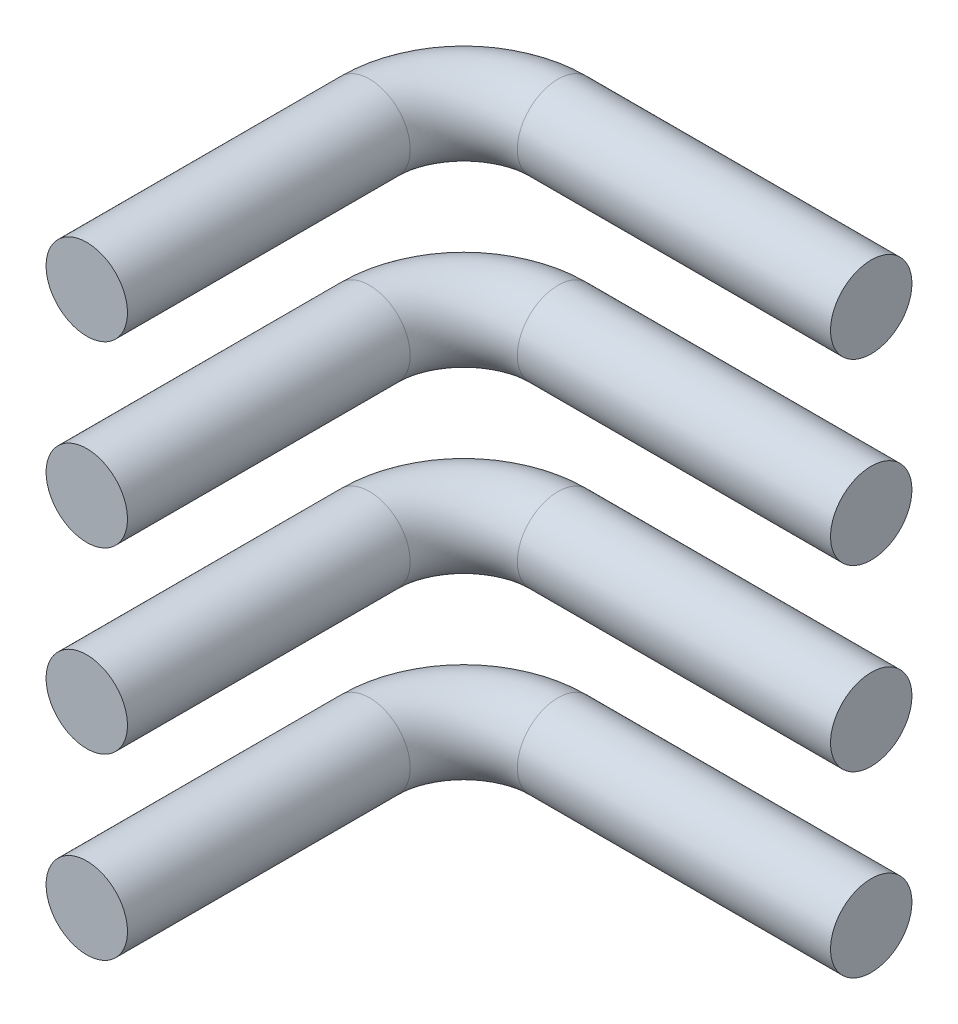
ISO-10303-21;
HEADER;
FILE_DESCRIPTION(('STEP AP214'),'2;1');
FILE_NAME('part.step','',(''),(''),'','','');
FILE_SCHEMA(('AUTOMOTIVE_DESIGN { 1 0 10303 214 1 1 1 1 }'));
ENDSEC;
DATA;
#1=APPLICATION_CONTEXT('core data for automotive mechanical design processes');
#2=APPLICATION_PROTOCOL_DEFINITION('international standard','automotive_design',2000,#1);
#3=PRODUCT_CONTEXT('',#1,'mechanical');
#4=PRODUCT('Part','Part','',(#3));
#5=PRODUCT_RELATED_PRODUCT_CATEGORY('part','',(#4));
#6=PRODUCT_DEFINITION_FORMATION('','',#4);
#7=PRODUCT_DEFINITION_CONTEXT('part definition',#1,'design');
#8=PRODUCT_DEFINITION('design','',#6,#7);
#9=PRODUCT_DEFINITION_SHAPE('','',#8);
#10=(LENGTH_UNIT() NAMED_UNIT(*) SI_UNIT(.MILLI.,.METRE.));
#11=(NAMED_UNIT(*) PLANE_ANGLE_UNIT() SI_UNIT($,.RADIAN.));
#12=(NAMED_UNIT(*) SI_UNIT($,.STERADIAN.) SOLID_ANGLE_UNIT());
#13=UNCERTAINTY_MEASURE_WITH_UNIT(LENGTH_MEASURE(1.E-05),#10,'distance_accuracy_value','');
#14=(GEOMETRIC_REPRESENTATION_CONTEXT(3) GLOBAL_UNCERTAINTY_ASSIGNED_CONTEXT((#13)) GLOBAL_UNIT_ASSIGNED_CONTEXT((#10,
#11,#12)) REPRESENTATION_CONTEXT('',''));
#15=CARTESIAN_POINT('',(0.,0.,0.));
#16=DIRECTION('',(0.,0.,1.));
#17=DIRECTION('',(1.,0.,0.));
#18=AXIS2_PLACEMENT_3D('',#15,#16,#17);
#19=CARTESIAN_POINT('',(0.,4.29855600558658,5.));
#20=DIRECTION('',(0.,0.,1.));
#21=DIRECTION('',(1.,0.,0.));
#22=AXIS2_PLACEMENT_3D('',#19,#20,#21);
#23=CYLINDRICAL_SURFACE('',#22,2.159);
#24=CARTESIAN_POINT('',(0.,4.29855600558658,5.));
#25=DIRECTION('',(0.,0.,-1.));
#26=DIRECTION('',(-1.,0.,0.));
#27=AXIS2_PLACEMENT_3D('',#24,#25,#26);
#28=CIRCLE('',#27,2.159);
#29=CARTESIAN_POINT('',(-2.159,4.29855600558658,5.));
#30=VERTEX_POINT('',#29);
#31=EDGE_CURVE('E43',#30,#30,#28,.T.);
#32=ORIENTED_EDGE('',*,*,#31,.F.);
#33=EDGE_LOOP('',(#32));
#34=FACE_BOUND('',#33,.T.);
#35=CARTESIAN_POINT('',(0.,4.29855600558658,20.));
#36=DIRECTION('',(0.,0.,-1.));
#37=DIRECTION('',(-1.,0.,0.));
#38=AXIS2_PLACEMENT_3D('',#35,#36,#37);
#39=CIRCLE('',#38,2.159);
#40=CARTESIAN_POINT('',(-2.159,4.29855600558658,20.));
#41=VERTEX_POINT('',#40);
#42=EDGE_CURVE('E11',#41,#41,#39,.T.);
#43=ORIENTED_EDGE('',*,*,#42,.T.);
#44=EDGE_LOOP('',(#43));
#45=FACE_BOUND('',#44,.T.);
#46=ADVANCED_FACE('F37',(#34,#45),#23,.T.);
#47=CARTESIAN_POINT('',(5.,4.29855600558658,5.));
#48=DIRECTION('',(0.,1.,0.));
#49=DIRECTION('',(0.,0.,1.));
#50=AXIS2_PLACEMENT_3D('',#47,#48,#49);
#51=TOROIDAL_SURFACE('',#50,5.,2.159);
#52=CARTESIAN_POINT('',(5.00000000000004,4.29855600558658,0.));
#53=DIRECTION('',(1.,0.,0.));
#54=DIRECTION('',(0.,0.,-1.));
#55=AXIS2_PLACEMENT_3D('',#52,#53,#54);
#56=CIRCLE('',#55,2.159);
#57=CARTESIAN_POINT('',(5.00000000000006,4.29855600558658,-2.159));
#58=VERTEX_POINT('',#57);
#59=EDGE_CURVE('E47',#58,#58,#56,.T.);
#60=CARTESIAN_POINT('',(5.,4.29855600558658,5.));
#61=DIRECTION('',(0.,1.,0.));
#62=DIRECTION('',(0.,0.,1.));
#63=AXIS2_PLACEMENT_3D('',#60,#61,#62);
#64=CIRCLE('',#63,7.159);
#65=EDGE_CURVE('',#58,#30,#64,.T.);
#66=ORIENTED_EDGE('',*,*,#59,.F.);
#67=ORIENTED_EDGE('',*,*,#31,.T.);
#68=ORIENTED_EDGE('',*,*,#65,.T.);
#69=ORIENTED_EDGE('',*,*,#65,.F.);
#70=EDGE_LOOP('',(#66,#68,#67,#69));
#71=FACE_BOUND('',#70,.T.);
#72=ADVANCED_FACE('F63',(#71),#51,.T.);
#73=CARTESIAN_POINT('',(18.3666500000001,4.29855600558658,0.));
#74=DIRECTION('',(1.,0.,0.));
#75=DIRECTION('',(0.,0.,-1.));
#76=AXIS2_PLACEMENT_3D('',#73,#74,#75);
#77=CYLINDRICAL_SURFACE('',#76,2.159);
#78=CARTESIAN_POINT('',(21.61665,4.29855600558658,0.));
#79=DIRECTION('',(1.,0.,0.));
#80=DIRECTION('',(0.,0.,-1.));
#81=AXIS2_PLACEMENT_3D('',#78,#79,#80);
#82=CIRCLE('',#81,2.159);
#83=CARTESIAN_POINT('',(21.61665,4.29855600558658,-2.159));
#84=VERTEX_POINT('',#83);
#85=EDGE_CURVE('E51',#84,#84,#82,.T.);
#86=CARTESIAN_POINT('',(21.61665,4.29855600558658,-2.159));
#87=CARTESIAN_POINT('',(21.4435598958334,4.29855600558658,-2.159));
#88=CARTESIAN_POINT('',(21.2704697916667,4.29855600558658,-2.159));
#89=CARTESIAN_POINT('',(20.9242895833334,4.29855600558658,-2.159));
#90=CARTESIAN_POINT('',(20.7511994791667,4.29855600558658,-2.159));
#91=CARTESIAN_POINT('',(20.4050192708334,4.29855600558658,-2.159));
#92=CARTESIAN_POINT('',(20.2319291666667,4.29855600558658,-2.159));
#93=CARTESIAN_POINT('',(19.8857489583334,4.29855600558658,-2.159));
#94=CARTESIAN_POINT('',(19.7126588541667,4.29855600558658,-2.159));
#95=CARTESIAN_POINT('',(19.3664786458334,4.29855600558658,-2.159));
#96=CARTESIAN_POINT('',(19.1933885416667,4.29855600558658,-2.159));
#97=CARTESIAN_POINT('',(18.8472083333334,4.29855600558658,-2.159));
#98=CARTESIAN_POINT('',(18.6741182291667,4.29855600558658,-2.159));
#99=CARTESIAN_POINT('',(18.3279380208334,4.29855600558658,-2.159));
#100=CARTESIAN_POINT('',(18.1548479166667,4.29855600558658,-2.159));
#101=CARTESIAN_POINT('',(17.8086677083334,4.29855600558658,-2.159));
#102=CARTESIAN_POINT('',(17.6355776041667,4.29855600558658,-2.159));
#103=CARTESIAN_POINT('',(17.2893973958334,4.29855600558658,-2.159));
#104=CARTESIAN_POINT('',(17.1163072916667,4.29855600558658,-2.159));
#105=CARTESIAN_POINT('',(16.7701270833334,4.29855600558658,-2.159));
#106=CARTESIAN_POINT('',(16.5970369791667,4.29855600558658,-2.159));
#107=CARTESIAN_POINT('',(16.2508567708334,4.29855600558658,-2.159));
#108=CARTESIAN_POINT('',(16.0777666666667,4.29855600558658,-2.159));
#109=CARTESIAN_POINT('',(15.7315864583334,4.29855600558658,-2.159));
#110=CARTESIAN_POINT('',(15.5584963541667,4.29855600558658,-2.159));
#111=CARTESIAN_POINT('',(15.2123161458334,4.29855600558658,-2.159));
#112=CARTESIAN_POINT('',(15.0392260416667,4.29855600558658,-2.159));
#113=CARTESIAN_POINT('',(14.6930458333334,4.29855600558658,-2.159));
#114=CARTESIAN_POINT('',(14.5199557291667,4.29855600558658,-2.159));
#115=CARTESIAN_POINT('',(14.1737755208334,4.29855600558658,-2.159));
#116=CARTESIAN_POINT('',(14.0006854166667,4.29855600558658,-2.159));
#117=CARTESIAN_POINT('',(13.6545052083334,4.29855600558658,-2.159));
#118=CARTESIAN_POINT('',(13.4814151041667,4.29855600558658,-2.159));
#119=CARTESIAN_POINT('',(13.1352348958334,4.29855600558658,-2.159));
#120=CARTESIAN_POINT('',(12.9621447916667,4.29855600558658,-2.159));
#121=CARTESIAN_POINT('',(12.6159645833334,4.29855600558658,-2.159));
#122=CARTESIAN_POINT('',(12.4428744791667,4.29855600558658,-2.159));
#123=CARTESIAN_POINT('',(12.0966942708334,4.29855600558658,-2.159));
#124=CARTESIAN_POINT('',(11.9236041666667,4.29855600558658,-2.159));
#125=CARTESIAN_POINT('',(11.5774239583334,4.29855600558658,-2.159));
#126=CARTESIAN_POINT('',(11.4043338541667,4.29855600558658,-2.159));
#127=CARTESIAN_POINT('',(11.0581536458334,4.29855600558658,-2.159));
#128=CARTESIAN_POINT('',(10.8850635416667,4.29855600558658,-2.159));
#129=CARTESIAN_POINT('',(10.5388833333334,4.29855600558658,-2.159));
#130=CARTESIAN_POINT('',(10.3657932291667,4.29855600558658,-2.159));
#131=CARTESIAN_POINT('',(10.0196130208334,4.29855600558658,-2.159));
#132=CARTESIAN_POINT('',(9.84652291666671,4.29855600558658,-2.159));
#133=CARTESIAN_POINT('',(9.50034270833338,4.29855600558658,-2.159));
#134=CARTESIAN_POINT('',(9.32725260416671,4.29855600558658,-2.159));
#135=CARTESIAN_POINT('',(8.98107239583338,4.29855600558658,-2.159));
#136=CARTESIAN_POINT('',(8.80798229166671,4.29855600558658,-2.159));
#137=CARTESIAN_POINT('',(8.46180208333338,4.29855600558658,-2.159));
#138=CARTESIAN_POINT('',(8.28871197916671,4.29855600558658,-2.159));
#139=CARTESIAN_POINT('',(7.94253177083338,4.29855600558658,-2.159));
#140=CARTESIAN_POINT('',(7.76944166666672,4.29855600558658,-2.159));
#141=CARTESIAN_POINT('',(7.42326145833338,4.29855600558658,-2.159));
#142=CARTESIAN_POINT('',(7.25017135416672,4.29855600558658,-2.159));
#143=CARTESIAN_POINT('',(6.90399114583338,4.29855600558658,-2.159));
#144=CARTESIAN_POINT('',(6.73090104166672,4.29855600558658,-2.159));
#145=CARTESIAN_POINT('',(6.38472083333339,4.29855600558658,-2.159));
#146=CARTESIAN_POINT('',(6.21163072916672,4.29855600558658,-2.159));
#147=CARTESIAN_POINT('',(5.86545052083339,4.29855600558658,-2.159));
#148=CARTESIAN_POINT('',(5.69236041666672,4.29855600558658,-2.159));
#149=CARTESIAN_POINT('',(5.34618020833339,4.29855600558658,-2.159));
#150=CARTESIAN_POINT('',(5.17309010416672,4.29855600558658,-2.159));
#151=CARTESIAN_POINT('',(5.00000000000006,4.29855600558658,-2.159));
#152=B_SPLINE_CURVE_WITH_KNOTS('',3,(#86,#87,#88,#89,#90,#91,#92,#93,#94,#95,#96,#97,#98,#99,
#100,#101,#102,#103,#104,#105,#106,#107,#108,#109,#110,#111,#112,#113,#114,#115,#116,#117,#118,
#119,#120,#121,#122,#123,#124,#125,#126,#127,#128,#129,#130,#131,#132,#133,#134,#135,#136,#137,
#138,#139,#140,#141,#142,#143,#144,#145,#146,#147,#148,#149,#150,#151),.UNSPECIFIED.,.F.,.F.,(4,
2,2,2,2,2,2,2,2,2,2,2,2,2,2,2,2,2,2,2,2,2,2,2,2,2,2,2,2,2,2,2,4),(0.,0.5192703125,1.038540625,
1.5578109375,2.07708125,2.59635156249999,3.115621875,3.63489218749999,4.15416249999999,
4.67343281249999,5.19270312499999,5.71197343749999,6.23124374999999,6.75051406249999,
7.26978437499998,7.78905468749998,8.30832499999998,8.82759531249998,9.34686562499998,
9.86613593749998,10.38540625,10.9046765625,11.423946875,11.9432171875,12.4624875,12.9817578125,
13.501028125,14.0202984375,14.53956875,15.0588390625,15.578109375,16.0973796875,16.61665),.UNSPECIFIED.);
#153=EDGE_CURVE('BSEAM59',#84,#58,#152,.T.);
#154=ORIENTED_EDGE('',*,*,#85,.F.);
#155=ORIENTED_EDGE('',*,*,#59,.T.);
#156=ORIENTED_EDGE('',*,*,#153,.T.);
#157=ORIENTED_EDGE('',*,*,#153,.F.);
#158=EDGE_LOOP('',(#154,#156,#155,#157));
#159=FACE_BOUND('',#158,.T.);
#160=ADVANCED_FACE('F59',(#159),#77,.T.);
#161=CARTESIAN_POINT('',(0.,4.29855600558658,20.));
#162=DIRECTION('',(0.,0.,-1.));
#163=DIRECTION('',(-1.,0.,0.));
#164=AXIS2_PLACEMENT_3D('',#161,#162,#163);
#165=PLANE('',#164);
#166=ORIENTED_EDGE('',*,*,#42,.F.);
#167=EDGE_LOOP('',(#166));
#168=FACE_BOUND('',#167,.T.);
#169=ADVANCED_FACE('F62',(#168),#165,.F.);
#170=CARTESIAN_POINT('',(21.61665,4.29855600558658,0.));
#171=DIRECTION('',(1.,0.,0.));
#172=DIRECTION('',(0.,0.,-1.));
#173=AXIS2_PLACEMENT_3D('',#170,#171,#172);
#174=PLANE('',#173);
#175=ORIENTED_EDGE('',*,*,#85,.T.);
#176=EDGE_LOOP('',(#175));
#177=FACE_BOUND('',#176,.T.);
#178=ADVANCED_FACE('F57',(#177),#174,.T.);
#179=CLOSED_SHELL('',(#46,#72,#160,#169,#178));
#180=MANIFOLD_SOLID_BREP('B2',#179);
#181=CARTESIAN_POINT('',(0.,-5.17564399441342,5.));
#182=DIRECTION('',(0.,0.,1.));
#183=DIRECTION('',(1.,0.,0.));
#184=AXIS2_PLACEMENT_3D('',#181,#182,#183);
#185=CYLINDRICAL_SURFACE('',#184,2.159);
#186=CARTESIAN_POINT('',(0.,-5.17564399441342,5.));
#187=DIRECTION('',(0.,0.,-1.));
#188=DIRECTION('',(-1.,0.,0.));
#189=AXIS2_PLACEMENT_3D('',#186,#187,#188);
#190=CIRCLE('',#189,2.159);
#191=CARTESIAN_POINT('',(-2.159,-5.17564399441342,5.));
#192=VERTEX_POINT('',#191);
#193=EDGE_CURVE('E124',#192,#192,#190,.T.);
#194=ORIENTED_EDGE('',*,*,#193,.F.);
#195=EDGE_LOOP('',(#194));
#196=FACE_BOUND('',#195,.T.);
#197=CARTESIAN_POINT('',(0.,-5.17564399441342,20.));
#198=DIRECTION('',(0.,0.,-1.));
#199=DIRECTION('',(-1.,0.,0.));
#200=AXIS2_PLACEMENT_3D('',#197,#198,#199);
#201=CIRCLE('',#200,2.159);
#202=CARTESIAN_POINT('',(-2.159,-5.17564399441342,20.));
#203=VERTEX_POINT('',#202);
#204=EDGE_CURVE('E36',#203,#203,#201,.T.);
#205=ORIENTED_EDGE('',*,*,#204,.T.);
#206=EDGE_LOOP('',(#205));
#207=FACE_BOUND('',#206,.T.);
#208=ADVANCED_FACE('F118',(#196,#207),#185,.T.);
#209=CARTESIAN_POINT('',(5.,-5.17564399441342,5.));
#210=DIRECTION('',(0.,1.,0.));
#211=DIRECTION('',(0.,0.,1.));
#212=AXIS2_PLACEMENT_3D('',#209,#210,#211);
#213=TOROIDAL_SURFACE('',#212,5.,2.159);
#214=CARTESIAN_POINT('',(5.00000000000004,-5.17564399441342,0.));
#215=DIRECTION('',(1.,0.,0.));
#216=DIRECTION('',(0.,0.,-1.));
#217=AXIS2_PLACEMENT_3D('',#214,#215,#216);
#218=CIRCLE('',#217,2.159);
#219=CARTESIAN_POINT('',(5.00000000000006,-5.17564399441342,-2.159));
#220=VERTEX_POINT('',#219);
#221=EDGE_CURVE('E128',#220,#220,#218,.T.);
#222=CARTESIAN_POINT('',(5.,-5.17564399441342,5.));
#223=DIRECTION('',(0.,1.,0.));
#224=DIRECTION('',(0.,0.,1.));
#225=AXIS2_PLACEMENT_3D('',#222,#223,#224);
#226=CIRCLE('',#225,7.159);
#227=EDGE_CURVE('',#220,#192,#226,.T.);
#228=ORIENTED_EDGE('',*,*,#221,.F.);
#229=ORIENTED_EDGE('',*,*,#193,.T.);
#230=ORIENTED_EDGE('',*,*,#227,.T.);
#231=ORIENTED_EDGE('',*,*,#227,.F.);
#232=EDGE_LOOP('',(#228,#230,#229,#231));
#233=FACE_BOUND('',#232,.T.);
#234=ADVANCED_FACE('F144',(#233),#213,.T.);
#235=CARTESIAN_POINT('',(18.3666500000001,-5.17564399441342,0.));
#236=DIRECTION('',(1.,0.,0.));
#237=DIRECTION('',(0.,0.,-1.));
#238=AXIS2_PLACEMENT_3D('',#235,#236,#237);
#239=CYLINDRICAL_SURFACE('',#238,2.159);
#240=CARTESIAN_POINT('',(21.61665,-5.17564399441342,0.));
#241=DIRECTION('',(1.,0.,0.));
#242=DIRECTION('',(0.,0.,-1.));
#243=AXIS2_PLACEMENT_3D('',#240,#241,#242);
#244=CIRCLE('',#243,2.159);
#245=CARTESIAN_POINT('',(21.61665,-5.17564399441342,-2.159));
#246=VERTEX_POINT('',#245);
#247=EDGE_CURVE('E132',#246,#246,#244,.T.);
#248=CARTESIAN_POINT('',(21.61665,-5.17564399441342,-2.159));
#249=CARTESIAN_POINT('',(21.4435598958334,-5.17564399441342,-2.159));
#250=CARTESIAN_POINT('',(21.2704697916667,-5.17564399441342,-2.159));
#251=CARTESIAN_POINT('',(20.9242895833334,-5.17564399441342,-2.159));
#252=CARTESIAN_POINT('',(20.7511994791667,-5.17564399441342,-2.159));
#253=CARTESIAN_POINT('',(20.4050192708334,-5.17564399441342,-2.159));
#254=CARTESIAN_POINT('',(20.2319291666667,-5.17564399441342,-2.159));
#255=CARTESIAN_POINT('',(19.8857489583334,-5.17564399441342,-2.159));
#256=CARTESIAN_POINT('',(19.7126588541667,-5.17564399441342,-2.159));
#257=CARTESIAN_POINT('',(19.3664786458334,-5.17564399441342,-2.159));
#258=CARTESIAN_POINT('',(19.1933885416667,-5.17564399441342,-2.159));
#259=CARTESIAN_POINT('',(18.8472083333334,-5.17564399441342,-2.159));
#260=CARTESIAN_POINT('',(18.6741182291667,-5.17564399441342,-2.159));
#261=CARTESIAN_POINT('',(18.3279380208334,-5.17564399441342,-2.159));
#262=CARTESIAN_POINT('',(18.1548479166667,-5.17564399441342,-2.159));
#263=CARTESIAN_POINT('',(17.8086677083334,-5.17564399441342,-2.159));
#264=CARTESIAN_POINT('',(17.6355776041667,-5.17564399441342,-2.159));
#265=CARTESIAN_POINT('',(17.2893973958334,-5.17564399441342,-2.159));
#266=CARTESIAN_POINT('',(17.1163072916667,-5.17564399441342,-2.159));
#267=CARTESIAN_POINT('',(16.7701270833334,-5.17564399441342,-2.159));
#268=CARTESIAN_POINT('',(16.5970369791667,-5.17564399441342,-2.159));
#269=CARTESIAN_POINT('',(16.2508567708334,-5.17564399441342,-2.159));
#270=CARTESIAN_POINT('',(16.0777666666667,-5.17564399441342,-2.159));
#271=CARTESIAN_POINT('',(15.7315864583334,-5.17564399441342,-2.159));
#272=CARTESIAN_POINT('',(15.5584963541667,-5.17564399441342,-2.159));
#273=CARTESIAN_POINT('',(15.2123161458334,-5.17564399441342,-2.159));
#274=CARTESIAN_POINT('',(15.0392260416667,-5.17564399441342,-2.159));
#275=CARTESIAN_POINT('',(14.6930458333334,-5.17564399441342,-2.159));
#276=CARTESIAN_POINT('',(14.5199557291667,-5.17564399441342,-2.159));
#277=CARTESIAN_POINT('',(14.1737755208334,-5.17564399441342,-2.159));
#278=CARTESIAN_POINT('',(14.0006854166667,-5.17564399441342,-2.159));
#279=CARTESIAN_POINT('',(13.6545052083334,-5.17564399441342,-2.159));
#280=CARTESIAN_POINT('',(13.4814151041667,-5.17564399441342,-2.159));
#281=CARTESIAN_POINT('',(13.1352348958334,-5.17564399441342,-2.159));
#282=CARTESIAN_POINT('',(12.9621447916667,-5.17564399441342,-2.159));
#283=CARTESIAN_POINT('',(12.6159645833334,-5.17564399441342,-2.159));
#284=CARTESIAN_POINT('',(12.4428744791667,-5.17564399441342,-2.159));
#285=CARTESIAN_POINT('',(12.0966942708334,-5.17564399441342,-2.159));
#286=CARTESIAN_POINT('',(11.9236041666667,-5.17564399441342,-2.159));
#287=CARTESIAN_POINT('',(11.5774239583334,-5.17564399441342,-2.159));
#288=CARTESIAN_POINT('',(11.4043338541667,-5.17564399441342,-2.159));
#289=CARTESIAN_POINT('',(11.0581536458334,-5.17564399441342,-2.159));
#290=CARTESIAN_POINT('',(10.8850635416667,-5.17564399441342,-2.159));
#291=CARTESIAN_POINT('',(10.5388833333334,-5.17564399441342,-2.159));
#292=CARTESIAN_POINT('',(10.3657932291667,-5.17564399441342,-2.159));
#293=CARTESIAN_POINT('',(10.0196130208334,-5.17564399441342,-2.159));
#294=CARTESIAN_POINT('',(9.84652291666671,-5.17564399441342,-2.159));
#295=CARTESIAN_POINT('',(9.50034270833338,-5.17564399441342,-2.159));
#296=CARTESIAN_POINT('',(9.32725260416671,-5.17564399441342,-2.159));
#297=CARTESIAN_POINT('',(8.98107239583338,-5.17564399441342,-2.159));
#298=CARTESIAN_POINT('',(8.80798229166671,-5.17564399441342,-2.159));
#299=CARTESIAN_POINT('',(8.46180208333338,-5.17564399441342,-2.159));
#300=CARTESIAN_POINT('',(8.28871197916671,-5.17564399441342,-2.159));
#301=CARTESIAN_POINT('',(7.94253177083338,-5.17564399441342,-2.159));
#302=CARTESIAN_POINT('',(7.76944166666672,-5.17564399441342,-2.159));
#303=CARTESIAN_POINT('',(7.42326145833338,-5.17564399441342,-2.159));
#304=CARTESIAN_POINT('',(7.25017135416672,-5.17564399441342,-2.159));
#305=CARTESIAN_POINT('',(6.90399114583338,-5.17564399441342,-2.159));
#306=CARTESIAN_POINT('',(6.73090104166672,-5.17564399441342,-2.159));
#307=CARTESIAN_POINT('',(6.38472083333339,-5.17564399441342,-2.159));
#308=CARTESIAN_POINT('',(6.21163072916672,-5.17564399441342,-2.159));
#309=CARTESIAN_POINT('',(5.86545052083339,-5.17564399441342,-2.159));
#310=CARTESIAN_POINT('',(5.69236041666672,-5.17564399441342,-2.159));
#311=CARTESIAN_POINT('',(5.34618020833339,-5.17564399441342,-2.159));
#312=CARTESIAN_POINT('',(5.17309010416672,-5.17564399441342,-2.159));
#313=CARTESIAN_POINT('',(5.00000000000006,-5.17564399441342,-2.159));
#314=B_SPLINE_CURVE_WITH_KNOTS('',3,(#248,#249,#250,#251,#252,#253,#254,#255,#256,#257,#258,
#259,#260,#261,#262,#263,#264,#265,#266,#267,#268,#269,#270,#271,#272,#273,#274,#275,#276,#277,
#278,#279,#280,#281,#282,#283,#284,#285,#286,#287,#288,#289,#290,#291,#292,#293,#294,#295,#296,
#297,#298,#299,#300,#301,#302,#303,#304,#305,#306,#307,#308,#309,#310,#311,#312,#313),
.UNSPECIFIED.,.F.,.F.,(4,2,2,2,2,2,2,2,2,2,2,2,2,2,2,2,2,2,2,2,2,2,2,2,2,2,2,2,2,2,2,2,4),(0.,
0.5192703125,1.038540625,1.5578109375,2.07708125,2.59635156249999,3.115621875,3.63489218749999,
4.15416249999999,4.67343281249999,5.19270312499999,5.71197343749999,6.23124374999999,
6.75051406249999,7.26978437499998,7.78905468749998,8.30832499999998,8.82759531249998,
9.34686562499998,9.86613593749998,10.38540625,10.9046765625,11.423946875,11.9432171875,
12.4624875,12.9817578125,13.501028125,14.0202984375,14.53956875,15.0588390625,15.578109375,
16.0973796875,16.61665),.UNSPECIFIED.);
#315=EDGE_CURVE('BSEAM140',#246,#220,#314,.T.);
#316=ORIENTED_EDGE('',*,*,#247,.F.);
#317=ORIENTED_EDGE('',*,*,#221,.T.);
#318=ORIENTED_EDGE('',*,*,#315,.T.);
#319=ORIENTED_EDGE('',*,*,#315,.F.);
#320=EDGE_LOOP('',(#316,#318,#317,#319));
#321=FACE_BOUND('',#320,.T.);
#322=ADVANCED_FACE('F140',(#321),#239,.T.);
#323=CARTESIAN_POINT('',(0.,-5.17564399441342,20.));
#324=DIRECTION('',(0.,0.,-1.));
#325=DIRECTION('',(-1.,0.,0.));
#326=AXIS2_PLACEMENT_3D('',#323,#324,#325);
#327=PLANE('',#326);
#328=ORIENTED_EDGE('',*,*,#204,.F.);
#329=EDGE_LOOP('',(#328));
#330=FACE_BOUND('',#329,.T.);
#331=ADVANCED_FACE('F143',(#330),#327,.F.);
#332=CARTESIAN_POINT('',(21.61665,-5.17564399441342,0.));
#333=DIRECTION('',(1.,0.,0.));
#334=DIRECTION('',(0.,0.,-1.));
#335=AXIS2_PLACEMENT_3D('',#332,#333,#334);
#336=PLANE('',#335);
#337=ORIENTED_EDGE('',*,*,#247,.T.);
#338=EDGE_LOOP('',(#337));
#339=FACE_BOUND('',#338,.T.);
#340=ADVANCED_FACE('F138',(#339),#336,.T.);
#341=CLOSED_SHELL('',(#208,#234,#322,#331,#340));
#342=MANIFOLD_SOLID_BREP('B6',#341);
#343=CARTESIAN_POINT('',(0.,13.7727560055866,5.));
#344=DIRECTION('',(0.,0.,1.));
#345=DIRECTION('',(1.,0.,0.));
#346=AXIS2_PLACEMENT_3D('',#343,#344,#345);
#347=CYLINDRICAL_SURFACE('',#346,2.159);
#348=CARTESIAN_POINT('',(0.,13.7727560055866,5.));
#349=DIRECTION('',(0.,0.,-1.));
#350=DIRECTION('',(-1.,0.,0.));
#351=AXIS2_PLACEMENT_3D('',#348,#349,#350);
#352=CIRCLE('',#351,2.159);
#353=CARTESIAN_POINT('',(-2.159,13.7727560055866,5.));
#354=VERTEX_POINT('',#353);
#355=EDGE_CURVE('E204',#354,#354,#352,.T.);
#356=ORIENTED_EDGE('',*,*,#355,.F.);
#357=EDGE_LOOP('',(#356));
#358=FACE_BOUND('',#357,.T.);
#359=CARTESIAN_POINT('',(0.,13.7727560055866,20.));
#360=DIRECTION('',(0.,0.,-1.));
#361=DIRECTION('',(-1.,0.,0.));
#362=AXIS2_PLACEMENT_3D('',#359,#360,#361);
#363=CIRCLE('',#362,2.159);
#364=CARTESIAN_POINT('',(-2.159,13.7727560055866,20.));
#365=VERTEX_POINT('',#364);
#366=EDGE_CURVE('E117',#365,#365,#363,.T.);
#367=ORIENTED_EDGE('',*,*,#366,.T.);
#368=EDGE_LOOP('',(#367));
#369=FACE_BOUND('',#368,.T.);
#370=ADVANCED_FACE('F198',(#358,#369),#347,.T.);
#371=CARTESIAN_POINT('',(5.,13.7727560055866,5.));
#372=DIRECTION('',(0.,1.,0.));
#373=DIRECTION('',(0.,0.,1.));
#374=AXIS2_PLACEMENT_3D('',#371,#372,#373);
#375=TOROIDAL_SURFACE('',#374,5.,2.159);
#376=CARTESIAN_POINT('',(5.00000000000004,13.7727560055866,0.));
#377=DIRECTION('',(1.,0.,0.));
#378=DIRECTION('',(0.,0.,-1.));
#379=AXIS2_PLACEMENT_3D('',#376,#377,#378);
#380=CIRCLE('',#379,2.159);
#381=CARTESIAN_POINT('',(5.00000000000006,13.7727560055866,-2.159));
#382=VERTEX_POINT('',#381);
#383=EDGE_CURVE('E208',#382,#382,#380,.T.);
#384=CARTESIAN_POINT('',(5.,13.7727560055866,5.));
#385=DIRECTION('',(0.,1.,0.));
#386=DIRECTION('',(0.,0.,1.));
#387=AXIS2_PLACEMENT_3D('',#384,#385,#386);
#388=CIRCLE('',#387,7.159);
#389=EDGE_CURVE('',#382,#354,#388,.T.);
#390=ORIENTED_EDGE('',*,*,#383,.F.);
#391=ORIENTED_EDGE('',*,*,#355,.T.);
#392=ORIENTED_EDGE('',*,*,#389,.T.);
#393=ORIENTED_EDGE('',*,*,#389,.F.);
#394=EDGE_LOOP('',(#390,#392,#391,#393));
#395=FACE_BOUND('',#394,.T.);
#396=ADVANCED_FACE('F224',(#395),#375,.T.);
#397=CARTESIAN_POINT('',(18.3666500000001,13.7727560055866,0.));
#398=DIRECTION('',(1.,0.,0.));
#399=DIRECTION('',(0.,0.,-1.));
#400=AXIS2_PLACEMENT_3D('',#397,#398,#399);
#401=CYLINDRICAL_SURFACE('',#400,2.159);
#402=CARTESIAN_POINT('',(21.61665,13.7727560055866,0.));
#403=DIRECTION('',(1.,0.,0.));
#404=DIRECTION('',(0.,0.,-1.));
#405=AXIS2_PLACEMENT_3D('',#402,#403,#404);
#406=CIRCLE('',#405,2.159);
#407=CARTESIAN_POINT('',(21.61665,13.7727560055866,-2.159));
#408=VERTEX_POINT('',#407);
#409=EDGE_CURVE('E212',#408,#408,#406,.T.);
#410=CARTESIAN_POINT('',(21.61665,13.7727560055866,-2.159));
#411=CARTESIAN_POINT('',(21.4435598958334,13.7727560055866,-2.159));
#412=CARTESIAN_POINT('',(21.2704697916667,13.7727560055866,-2.159));
#413=CARTESIAN_POINT('',(20.9242895833334,13.7727560055866,-2.159));
#414=CARTESIAN_POINT('',(20.7511994791667,13.7727560055866,-2.159));
#415=CARTESIAN_POINT('',(20.4050192708334,13.7727560055866,-2.159));
#416=CARTESIAN_POINT('',(20.2319291666667,13.7727560055866,-2.159));
#417=CARTESIAN_POINT('',(19.8857489583334,13.7727560055866,-2.159));
#418=CARTESIAN_POINT('',(19.7126588541667,13.7727560055866,-2.159));
#419=CARTESIAN_POINT('',(19.3664786458334,13.7727560055866,-2.159));
#420=CARTESIAN_POINT('',(19.1933885416667,13.7727560055866,-2.159));
#421=CARTESIAN_POINT('',(18.8472083333334,13.7727560055866,-2.159));
#422=CARTESIAN_POINT('',(18.6741182291667,13.7727560055866,-2.159));
#423=CARTESIAN_POINT('',(18.3279380208334,13.7727560055866,-2.159));
#424=CARTESIAN_POINT('',(18.1548479166667,13.7727560055866,-2.159));
#425=CARTESIAN_POINT('',(17.8086677083334,13.7727560055866,-2.159));
#426=CARTESIAN_POINT('',(17.6355776041667,13.7727560055866,-2.159));
#427=CARTESIAN_POINT('',(17.2893973958334,13.7727560055866,-2.159));
#428=CARTESIAN_POINT('',(17.1163072916667,13.7727560055866,-2.159));
#429=CARTESIAN_POINT('',(16.7701270833334,13.7727560055866,-2.159));
#430=CARTESIAN_POINT('',(16.5970369791667,13.7727560055866,-2.159));
#431=CARTESIAN_POINT('',(16.2508567708334,13.7727560055866,-2.159));
#432=CARTESIAN_POINT('',(16.0777666666667,13.7727560055866,-2.159));
#433=CARTESIAN_POINT('',(15.7315864583334,13.7727560055866,-2.159));
#434=CARTESIAN_POINT('',(15.5584963541667,13.7727560055866,-2.159));
#435=CARTESIAN_POINT('',(15.2123161458334,13.7727560055866,-2.159));
#436=CARTESIAN_POINT('',(15.0392260416667,13.7727560055866,-2.159));
#437=CARTESIAN_POINT('',(14.6930458333334,13.7727560055866,-2.159));
#438=CARTESIAN_POINT('',(14.5199557291667,13.7727560055866,-2.159));
#439=CARTESIAN_POINT('',(14.1737755208334,13.7727560055866,-2.159));
#440=CARTESIAN_POINT('',(14.0006854166667,13.7727560055866,-2.159));
#441=CARTESIAN_POINT('',(13.6545052083334,13.7727560055866,-2.159));
#442=CARTESIAN_POINT('',(13.4814151041667,13.7727560055866,-2.159));
#443=CARTESIAN_POINT('',(13.1352348958334,13.7727560055866,-2.159));
#444=CARTESIAN_POINT('',(12.9621447916667,13.7727560055866,-2.159));
#445=CARTESIAN_POINT('',(12.6159645833334,13.7727560055866,-2.159));
#446=CARTESIAN_POINT('',(12.4428744791667,13.7727560055866,-2.159));
#447=CARTESIAN_POINT('',(12.0966942708334,13.7727560055866,-2.159));
#448=CARTESIAN_POINT('',(11.9236041666667,13.7727560055866,-2.159));
#449=CARTESIAN_POINT('',(11.5774239583334,13.7727560055866,-2.159));
#450=CARTESIAN_POINT('',(11.4043338541667,13.7727560055866,-2.159));
#451=CARTESIAN_POINT('',(11.0581536458334,13.7727560055866,-2.159));
#452=CARTESIAN_POINT('',(10.8850635416667,13.7727560055866,-2.159));
#453=CARTESIAN_POINT('',(10.5388833333334,13.7727560055866,-2.159));
#454=CARTESIAN_POINT('',(10.3657932291667,13.7727560055866,-2.159));
#455=CARTESIAN_POINT('',(10.0196130208334,13.7727560055866,-2.159));
#456=CARTESIAN_POINT('',(9.84652291666671,13.7727560055866,-2.159));
#457=CARTESIAN_POINT('',(9.50034270833338,13.7727560055866,-2.159));
#458=CARTESIAN_POINT('',(9.32725260416671,13.7727560055866,-2.159));
#459=CARTESIAN_POINT('',(8.98107239583338,13.7727560055866,-2.159));
#460=CARTESIAN_POINT('',(8.80798229166671,13.7727560055866,-2.159));
#461=CARTESIAN_POINT('',(8.46180208333338,13.7727560055866,-2.159));
#462=CARTESIAN_POINT('',(8.28871197916671,13.7727560055866,-2.159));
#463=CARTESIAN_POINT('',(7.94253177083338,13.7727560055866,-2.159));
#464=CARTESIAN_POINT('',(7.76944166666672,13.7727560055866,-2.159));
#465=CARTESIAN_POINT('',(7.42326145833338,13.7727560055866,-2.159));
#466=CARTESIAN_POINT('',(7.25017135416672,13.7727560055866,-2.159));
#467=CARTESIAN_POINT('',(6.90399114583338,13.7727560055866,-2.159));
#468=CARTESIAN_POINT('',(6.73090104166672,13.7727560055866,-2.159));
#469=CARTESIAN_POINT('',(6.38472083333339,13.7727560055866,-2.159));
#470=CARTESIAN_POINT('',(6.21163072916672,13.7727560055866,-2.159));
#471=CARTESIAN_POINT('',(5.86545052083339,13.7727560055866,-2.159));
#472=CARTESIAN_POINT('',(5.69236041666672,13.7727560055866,-2.159));
#473=CARTESIAN_POINT('',(5.34618020833339,13.7727560055866,-2.159));
#474=CARTESIAN_POINT('',(5.17309010416672,13.7727560055866,-2.159));
#475=CARTESIAN_POINT('',(5.00000000000006,13.7727560055866,-2.159));
#476=B_SPLINE_CURVE_WITH_KNOTS('',3,(#410,#411,#412,#413,#414,#415,#416,#417,#418,#419,#420,
#421,#422,#423,#424,#425,#426,#427,#428,#429,#430,#431,#432,#433,#434,#435,#436,#437,#438,#439,
#440,#441,#442,#443,#444,#445,#446,#447,#448,#449,#450,#451,#452,#453,#454,#455,#456,#457,#458,
#459,#460,#461,#462,#463,#464,#465,#466,#467,#468,#469,#470,#471,#472,#473,#474,#475),
.UNSPECIFIED.,.F.,.F.,(4,2,2,2,2,2,2,2,2,2,2,2,2,2,2,2,2,2,2,2,2,2,2,2,2,2,2,2,2,2,2,2,4),(0.,
0.5192703125,1.038540625,1.5578109375,2.07708125,2.59635156249999,3.115621875,3.63489218749999,
4.15416249999999,4.67343281249999,5.19270312499999,5.71197343749999,6.23124374999999,
6.75051406249999,7.26978437499998,7.78905468749998,8.30832499999998,8.82759531249998,
9.34686562499998,9.86613593749998,10.38540625,10.9046765625,11.423946875,11.9432171875,
12.4624875,12.9817578125,13.501028125,14.0202984375,14.53956875,15.0588390625,15.578109375,
16.0973796875,16.61665),.UNSPECIFIED.);
#477=EDGE_CURVE('BSEAM220',#408,#382,#476,.T.);
#478=ORIENTED_EDGE('',*,*,#409,.F.);
#479=ORIENTED_EDGE('',*,*,#383,.T.);
#480=ORIENTED_EDGE('',*,*,#477,.T.);
#481=ORIENTED_EDGE('',*,*,#477,.F.);
#482=EDGE_LOOP('',(#478,#480,#479,#481));
#483=FACE_BOUND('',#482,.T.);
#484=ADVANCED_FACE('F220',(#483),#401,.T.);
#485=CARTESIAN_POINT('',(0.,13.7727560055866,20.));
#486=DIRECTION('',(0.,0.,-1.));
#487=DIRECTION('',(-1.,0.,0.));
#488=AXIS2_PLACEMENT_3D('',#485,#486,#487);
#489=PLANE('',#488);
#490=ORIENTED_EDGE('',*,*,#366,.F.);
#491=EDGE_LOOP('',(#490));
#492=FACE_BOUND('',#491,.T.);
#493=ADVANCED_FACE('F223',(#492),#489,.F.);
#494=CARTESIAN_POINT('',(21.61665,13.7727560055866,0.));
#495=DIRECTION('',(1.,0.,0.));
#496=DIRECTION('',(0.,0.,-1.));
#497=AXIS2_PLACEMENT_3D('',#494,#495,#496);
#498=PLANE('',#497);
#499=ORIENTED_EDGE('',*,*,#409,.T.);
#500=EDGE_LOOP('',(#499));
#501=FACE_BOUND('',#500,.T.);
#502=ADVANCED_FACE('F218',(#501),#498,.T.);
#503=CLOSED_SHELL('',(#370,#396,#484,#493,#502));
#504=MANIFOLD_SOLID_BREP('B31',#503);
#505=CARTESIAN_POINT('',(1.61713169263578E-13,23.2469560055866,5.));
#506=DIRECTION('',(0.,0.,1.));
#507=DIRECTION('',(1.,0.,0.));
#508=AXIS2_PLACEMENT_3D('',#505,#506,#507);
#509=CYLINDRICAL_SURFACE('',#508,2.159);
#510=CARTESIAN_POINT('',(1.61713169263578E-13,23.2469560055866,5.));
#511=DIRECTION('',(0.,0.,-1.));
#512=DIRECTION('',(-1.,0.,0.));
#513=AXIS2_PLACEMENT_3D('',#510,#511,#512);
#514=CIRCLE('',#513,2.159);
#515=CARTESIAN_POINT('',(-2.15899999999984,23.2469560055866,5.));
#516=VERTEX_POINT('',#515);
#517=EDGE_CURVE('E277',#516,#516,#514,.T.);
#518=ORIENTED_EDGE('',*,*,#517,.F.);
#519=EDGE_LOOP('',(#518));
#520=FACE_BOUND('',#519,.T.);
#521=CARTESIAN_POINT('',(1.63550139462299E-13,23.2469560055866,20.));
#522=DIRECTION('',(0.,0.,-1.));
#523=DIRECTION('',(-1.,0.,0.));
#524=AXIS2_PLACEMENT_3D('',#521,#522,#523);
#525=CIRCLE('',#524,2.159);
#526=CARTESIAN_POINT('',(-2.15899999999984,23.2469560055866,20.));
#527=VERTEX_POINT('',#526);
#528=EDGE_CURVE('E197',#527,#527,#525,.T.);
#529=ORIENTED_EDGE('',*,*,#528,.T.);
#530=EDGE_LOOP('',(#529));
#531=FACE_BOUND('',#530,.T.);
#532=ADVANCED_FACE('F271',(#520,#531),#509,.T.);
#533=CARTESIAN_POINT('',(5.,23.2469560055866,5.));
#534=DIRECTION('',(0.,1.,0.));
#535=DIRECTION('',(0.,0.,1.));
#536=AXIS2_PLACEMENT_3D('',#533,#534,#535);
#537=TOROIDAL_SURFACE('',#536,4.99999999999984,2.159);
#538=CARTESIAN_POINT('',(5.00000000000004,23.2469560055866,1.60504951356283E-13));
#539=DIRECTION('',(1.,0.,0.));
#540=DIRECTION('',(0.,0.,-1.));
#541=AXIS2_PLACEMENT_3D('',#538,#539,#540);
#542=CIRCLE('',#541,2.159);
#543=CARTESIAN_POINT('',(5.00000000000006,23.2469560055866,-2.15899999999984));
#544=VERTEX_POINT('',#543);
#545=EDGE_CURVE('E281',#544,#544,#542,.T.);
#546=CARTESIAN_POINT('',(5.,23.2469560055866,5.));
#547=DIRECTION('',(0.,1.,0.));
#548=DIRECTION('',(0.,0.,1.));
#549=AXIS2_PLACEMENT_3D('',#546,#547,#548);
#550=CIRCLE('',#549,7.15899999999984);
#551=EDGE_CURVE('',#544,#516,#550,.T.);
#552=ORIENTED_EDGE('',*,*,#545,.F.);
#553=ORIENTED_EDGE('',*,*,#517,.T.);
#554=ORIENTED_EDGE('',*,*,#551,.T.);
#555=ORIENTED_EDGE('',*,*,#551,.F.);
#556=EDGE_LOOP('',(#552,#554,#553,#555));
#557=FACE_BOUND('',#556,.T.);
#558=ADVANCED_FACE('F297',(#557),#537,.T.);
#559=CARTESIAN_POINT('',(18.3666500000001,23.2469560055866,1.60430648024817E-13));
#560=DIRECTION('',(1.,0.,0.));
#561=DIRECTION('',(0.,0.,-1.));
#562=AXIS2_PLACEMENT_3D('',#559,#560,#561);
#563=CYLINDRICAL_SURFACE('',#562,2.159);
#564=CARTESIAN_POINT('',(21.61665,23.2469560055866,1.60504951356283E-13));
#565=DIRECTION('',(1.,0.,0.));
#566=DIRECTION('',(0.,0.,-1.));
#567=AXIS2_PLACEMENT_3D('',#564,#565,#566);
#568=CIRCLE('',#567,2.159);
#569=CARTESIAN_POINT('',(21.61665,23.2469560055866,-2.15899999999984));
#570=VERTEX_POINT('',#569);
#571=EDGE_CURVE('E285',#570,#570,#568,.T.);
#572=CARTESIAN_POINT('',(21.61665,23.2469560055866,-2.15899999999984));
#573=CARTESIAN_POINT('',(21.4435598958334,23.2469560055866,-2.15899999999984));
#574=CARTESIAN_POINT('',(21.2704697916667,23.2469560055866,-2.15899999999984));
#575=CARTESIAN_POINT('',(20.9242895833334,23.2469560055866,-2.15899999999984));
#576=CARTESIAN_POINT('',(20.7511994791667,23.2469560055866,-2.15899999999984));
#577=CARTESIAN_POINT('',(20.4050192708334,23.2469560055866,-2.15899999999984));
#578=CARTESIAN_POINT('',(20.2319291666667,23.2469560055866,-2.15899999999984));
#579=CARTESIAN_POINT('',(19.8857489583334,23.2469560055866,-2.15899999999984));
#580=CARTESIAN_POINT('',(19.7126588541667,23.2469560055866,-2.15899999999984));
#581=CARTESIAN_POINT('',(19.3664786458334,23.2469560055866,-2.15899999999984));
#582=CARTESIAN_POINT('',(19.1933885416667,23.2469560055866,-2.15899999999984));
#583=CARTESIAN_POINT('',(18.8472083333334,23.2469560055866,-2.15899999999984));
#584=CARTESIAN_POINT('',(18.6741182291667,23.2469560055866,-2.15899999999984));
#585=CARTESIAN_POINT('',(18.3279380208334,23.2469560055866,-2.15899999999984));
#586=CARTESIAN_POINT('',(18.1548479166667,23.2469560055866,-2.15899999999984));
#587=CARTESIAN_POINT('',(17.8086677083334,23.2469560055866,-2.15899999999984));
#588=CARTESIAN_POINT('',(17.6355776041667,23.2469560055866,-2.15899999999984));
#589=CARTESIAN_POINT('',(17.2893973958334,23.2469560055866,-2.15899999999984));
#590=CARTESIAN_POINT('',(17.1163072916667,23.2469560055866,-2.15899999999984));
#591=CARTESIAN_POINT('',(16.7701270833334,23.2469560055866,-2.15899999999984));
#592=CARTESIAN_POINT('',(16.5970369791667,23.2469560055866,-2.15899999999984));
#593=CARTESIAN_POINT('',(16.2508567708334,23.2469560055866,-2.15899999999984));
#594=CARTESIAN_POINT('',(16.0777666666667,23.2469560055866,-2.15899999999984));
#595=CARTESIAN_POINT('',(15.7315864583334,23.2469560055866,-2.15899999999984));
#596=CARTESIAN_POINT('',(15.5584963541667,23.2469560055866,-2.15899999999984));
#597=CARTESIAN_POINT('',(15.2123161458334,23.2469560055866,-2.15899999999984));
#598=CARTESIAN_POINT('',(15.0392260416667,23.2469560055866,-2.15899999999984));
#599=CARTESIAN_POINT('',(14.6930458333334,23.2469560055866,-2.15899999999984));
#600=CARTESIAN_POINT('',(14.5199557291667,23.2469560055866,-2.15899999999984));
#601=CARTESIAN_POINT('',(14.1737755208334,23.2469560055866,-2.15899999999984));
#602=CARTESIAN_POINT('',(14.0006854166667,23.2469560055866,-2.15899999999984));
#603=CARTESIAN_POINT('',(13.6545052083334,23.2469560055866,-2.15899999999984));
#604=CARTESIAN_POINT('',(13.4814151041667,23.2469560055866,-2.15899999999984));
#605=CARTESIAN_POINT('',(13.1352348958334,23.2469560055866,-2.15899999999984));
#606=CARTESIAN_POINT('',(12.9621447916667,23.2469560055866,-2.15899999999984));
#607=CARTESIAN_POINT('',(12.6159645833334,23.2469560055866,-2.15899999999984));
#608=CARTESIAN_POINT('',(12.4428744791667,23.2469560055866,-2.15899999999984));
#609=CARTESIAN_POINT('',(12.0966942708334,23.2469560055866,-2.15899999999984));
#610=CARTESIAN_POINT('',(11.9236041666667,23.2469560055866,-2.15899999999984));
#611=CARTESIAN_POINT('',(11.5774239583334,23.2469560055866,-2.15899999999984));
#612=CARTESIAN_POINT('',(11.4043338541667,23.2469560055866,-2.15899999999984));
#613=CARTESIAN_POINT('',(11.0581536458334,23.2469560055866,-2.15899999999984));
#614=CARTESIAN_POINT('',(10.8850635416667,23.2469560055866,-2.15899999999984));
#615=CARTESIAN_POINT('',(10.5388833333334,23.2469560055866,-2.15899999999984));
#616=CARTESIAN_POINT('',(10.3657932291667,23.2469560055866,-2.15899999999984));
#617=CARTESIAN_POINT('',(10.0196130208334,23.2469560055866,-2.15899999999984));
#618=CARTESIAN_POINT('',(9.84652291666671,23.2469560055866,-2.15899999999984));
#619=CARTESIAN_POINT('',(9.50034270833338,23.2469560055866,-2.15899999999984));
#620=CARTESIAN_POINT('',(9.32725260416671,23.2469560055866,-2.15899999999984));
#621=CARTESIAN_POINT('',(8.98107239583338,23.2469560055866,-2.15899999999984));
#622=CARTESIAN_POINT('',(8.80798229166671,23.2469560055866,-2.15899999999984));
#623=CARTESIAN_POINT('',(8.46180208333338,23.2469560055866,-2.15899999999984));
#624=CARTESIAN_POINT('',(8.28871197916671,23.2469560055866,-2.15899999999984));
#625=CARTESIAN_POINT('',(7.94253177083338,23.2469560055866,-2.15899999999984));
#626=CARTESIAN_POINT('',(7.76944166666672,23.2469560055866,-2.15899999999984));
#627=CARTESIAN_POINT('',(7.42326145833338,23.2469560055866,-2.15899999999984));
#628=CARTESIAN_POINT('',(7.25017135416672,23.2469560055866,-2.15899999999984));
#629=CARTESIAN_POINT('',(6.90399114583338,23.2469560055866,-2.15899999999984));
#630=CARTESIAN_POINT('',(6.73090104166672,23.2469560055866,-2.15899999999984));
#631=CARTESIAN_POINT('',(6.38472083333339,23.2469560055866,-2.15899999999984));
#632=CARTESIAN_POINT('',(6.21163072916672,23.2469560055866,-2.15899999999984));
#633=CARTESIAN_POINT('',(5.86545052083339,23.2469560055866,-2.15899999999984));
#634=CARTESIAN_POINT('',(5.69236041666672,23.2469560055866,-2.15899999999984));
#635=CARTESIAN_POINT('',(5.34618020833339,23.2469560055866,-2.15899999999984));
#636=CARTESIAN_POINT('',(5.17309010416672,23.2469560055866,-2.15899999999984));
#637=CARTESIAN_POINT('',(5.00000000000006,23.2469560055866,-2.15899999999984));
#638=B_SPLINE_CURVE_WITH_KNOTS('',3,(#572,#573,#574,#575,#576,#577,#578,#579,#580,#581,#582,
#583,#584,#585,#586,#587,#588,#589,#590,#591,#592,#593,#594,#595,#596,#597,#598,#599,#600,#601,
#602,#603,#604,#605,#606,#607,#608,#609,#610,#611,#612,#613,#614,#615,#616,#617,#618,#619,#620,
#621,#622,#623,#624,#625,#626,#627,#628,#629,#630,#631,#632,#633,#634,#635,#636,#637),
.UNSPECIFIED.,.F.,.F.,(4,2,2,2,2,2,2,2,2,2,2,2,2,2,2,2,2,2,2,2,2,2,2,2,2,2,2,2,2,2,2,2,4),(0.,
0.5192703125,1.038540625,1.5578109375,2.07708125,2.59635156249999,3.115621875,3.63489218749999,
4.15416249999999,4.67343281249999,5.19270312499999,5.71197343749999,6.23124374999999,
6.75051406249999,7.26978437499998,7.78905468749998,8.30832499999998,8.82759531249998,
9.34686562499998,9.86613593749998,10.38540625,10.9046765625,11.423946875,11.9432171875,
12.4624875,12.9817578125,13.501028125,14.0202984375,14.53956875,15.0588390625,15.578109375,
16.0973796875,16.61665),.UNSPECIFIED.);
#639=EDGE_CURVE('BSEAM293',#570,#544,#638,.T.);
#640=ORIENTED_EDGE('',*,*,#571,.F.);
#641=ORIENTED_EDGE('',*,*,#545,.T.);
#642=ORIENTED_EDGE('',*,*,#639,.T.);
#643=ORIENTED_EDGE('',*,*,#639,.F.);
#644=EDGE_LOOP('',(#640,#642,#641,#643));
#645=FACE_BOUND('',#644,.T.);
#646=ADVANCED_FACE('F293',(#645),#563,.T.);
#647=CARTESIAN_POINT('',(1.63550139462299E-13,23.2469560055866,20.));
#648=DIRECTION('',(0.,0.,-1.));
#649=DIRECTION('',(-1.,0.,0.));
#650=AXIS2_PLACEMENT_3D('',#647,#648,#649);
#651=PLANE('',#650);
#652=ORIENTED_EDGE('',*,*,#528,.F.);
#653=EDGE_LOOP('',(#652));
#654=FACE_BOUND('',#653,.T.);
#655=ADVANCED_FACE('F296',(#654),#651,.F.);
#656=CARTESIAN_POINT('',(21.61665,23.2469560055866,1.60504951356283E-13));
#657=DIRECTION('',(1.,0.,0.));
#658=DIRECTION('',(0.,0.,-1.));
#659=AXIS2_PLACEMENT_3D('',#656,#657,#658);
#660=PLANE('',#659);
#661=ORIENTED_EDGE('',*,*,#571,.T.);
#662=EDGE_LOOP('',(#661));
#663=FACE_BOUND('',#662,.T.);
#664=ADVANCED_FACE('F291',(#663),#660,.T.);
#665=CLOSED_SHELL('',(#532,#558,#646,#655,#664));
#666=MANIFOLD_SOLID_BREP('B112',#665);
#667=ADVANCED_BREP_SHAPE_REPRESENTATION('',(#18,#180,#342,#504,#666),#14);
#668=SHAPE_DEFINITION_REPRESENTATION(#9,#667);
ENDSEC;
END-ISO-10303-21;
